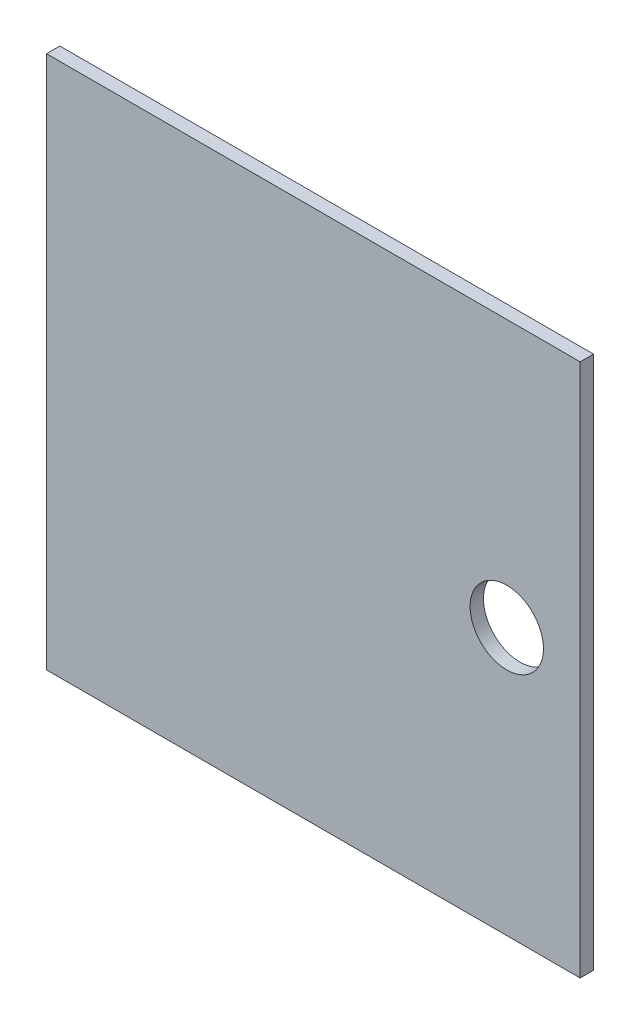
ISO-10303-21;
HEADER;
FILE_DESCRIPTION(('STEP AP214'),'2;1');
FILE_NAME('part.step','',(''),(''),'','','');
FILE_SCHEMA(('AUTOMOTIVE_DESIGN { 1 0 10303 214 1 1 1 1 }'));
ENDSEC;
DATA;
#1=APPLICATION_CONTEXT('core data for automotive mechanical design processes');
#2=APPLICATION_PROTOCOL_DEFINITION('international standard','automotive_design',2000,#1);
#3=PRODUCT_CONTEXT('',#1,'mechanical');
#4=PRODUCT('Part','Part','',(#3));
#5=PRODUCT_RELATED_PRODUCT_CATEGORY('part','',(#4));
#6=PRODUCT_DEFINITION_FORMATION('','',#4);
#7=PRODUCT_DEFINITION_CONTEXT('part definition',#1,'design');
#8=PRODUCT_DEFINITION('design','',#6,#7);
#9=PRODUCT_DEFINITION_SHAPE('','',#8);
#10=(LENGTH_UNIT() NAMED_UNIT(*) SI_UNIT(.MILLI.,.METRE.));
#11=(NAMED_UNIT(*) PLANE_ANGLE_UNIT() SI_UNIT($,.RADIAN.));
#12=(NAMED_UNIT(*) SI_UNIT($,.STERADIAN.) SOLID_ANGLE_UNIT());
#13=UNCERTAINTY_MEASURE_WITH_UNIT(LENGTH_MEASURE(1.E-05),#10,'distance_accuracy_value','');
#14=(GEOMETRIC_REPRESENTATION_CONTEXT(3) GLOBAL_UNCERTAINTY_ASSIGNED_CONTEXT((#13)) GLOBAL_UNIT_ASSIGNED_CONTEXT((#10,
#11,#12)) REPRESENTATION_CONTEXT('',''));
#15=CARTESIAN_POINT('',(0.,0.,0.));
#16=DIRECTION('',(0.,0.,1.));
#17=DIRECTION('',(1.,0.,0.));
#18=AXIS2_PLACEMENT_3D('',#15,#16,#17);
#19=CARTESIAN_POINT('',(0.,0.,10.));
#20=DIRECTION('',(-1.,0.,0.));
#21=DIRECTION('',(0.,0.,1.));
#22=AXIS2_PLACEMENT_3D('',#19,#20,#21);
#23=PLANE('',#22);
#24=DIRECTION('',(0.,1.,0.));
#25=VECTOR('',#24,1.);
#26=CARTESIAN_POINT('',(0.,0.,0.));
#27=LINE('',#26,#25);
#28=CARTESIAN_POINT('',(0.,0.,0.));
#29=VERTEX_POINT('',#28);
#30=CARTESIAN_POINT('',(0.,400.,0.));
#31=VERTEX_POINT('',#30);
#32=EDGE_CURVE('E99',#29,#31,#27,.T.);
#33=ORIENTED_EDGE('',*,*,#32,.F.);
#34=DIRECTION('',(0.,0.,-1.));
#35=VECTOR('',#34,1.);
#36=CARTESIAN_POINT('',(0.,0.,10.));
#37=LINE('',#36,#35);
#38=CARTESIAN_POINT('',(0.,0.,10.));
#39=VERTEX_POINT('',#38);
#40=EDGE_CURVE('E11',#39,#29,#37,.T.);
#41=ORIENTED_EDGE('',*,*,#40,.F.);
#42=DIRECTION('',(0.,1.,0.));
#43=VECTOR('',#42,1.);
#44=CARTESIAN_POINT('',(0.,0.,10.));
#45=LINE('',#44,#43);
#46=CARTESIAN_POINT('',(0.,400.,10.));
#47=VERTEX_POINT('',#46);
#48=EDGE_CURVE('E93',#39,#47,#45,.T.);
#49=ORIENTED_EDGE('',*,*,#48,.T.);
#50=DIRECTION('',(0.,0.,-1.));
#51=VECTOR('',#50,1.);
#52=CARTESIAN_POINT('',(0.,400.,10.));
#53=LINE('',#52,#51);
#54=EDGE_CURVE('E36',#47,#31,#53,.T.);
#55=ORIENTED_EDGE('',*,*,#54,.T.);
#56=EDGE_LOOP('',(#33,#41,#49,#55));
#57=FACE_BOUND('',#56,.T.);
#58=ADVANCED_FACE('F33',(#57),#23,.T.);
#59=CARTESIAN_POINT('',(0.,0.,10.));
#60=DIRECTION('',(0.,1.,0.));
#61=DIRECTION('',(0.,0.,1.));
#62=AXIS2_PLACEMENT_3D('',#59,#60,#61);
#63=PLANE('',#62);
#64=DIRECTION('',(1.,0.,0.));
#65=VECTOR('',#64,1.);
#66=CARTESIAN_POINT('',(0.,0.,0.));
#67=LINE('',#66,#65);
#68=CARTESIAN_POINT('',(400.,0.,0.));
#69=VERTEX_POINT('',#68);
#70=EDGE_CURVE('E66',#29,#69,#67,.T.);
#71=ORIENTED_EDGE('',*,*,#70,.T.);
#72=DIRECTION('',(0.,0.,-1.));
#73=VECTOR('',#72,1.);
#74=CARTESIAN_POINT('',(400.,0.,10.));
#75=LINE('',#74,#73);
#76=CARTESIAN_POINT('',(400.,0.,10.));
#77=VERTEX_POINT('',#76);
#78=EDGE_CURVE('E42',#77,#69,#75,.T.);
#79=ORIENTED_EDGE('',*,*,#78,.F.);
#80=DIRECTION('',(1.,0.,0.));
#81=VECTOR('',#80,1.);
#82=CARTESIAN_POINT('',(0.,0.,10.));
#83=LINE('',#82,#81);
#84=EDGE_CURVE('E83',#39,#77,#83,.T.);
#85=ORIENTED_EDGE('',*,*,#84,.F.);
#86=ORIENTED_EDGE('',*,*,#40,.T.);
#87=EDGE_LOOP('',(#71,#79,#85,#86));
#88=FACE_BOUND('',#87,.T.);
#89=ADVANCED_FACE('F110',(#88),#63,.F.);
#90=CARTESIAN_POINT('',(400.,0.,10.));
#91=DIRECTION('',(-1.,0.,0.));
#92=DIRECTION('',(0.,0.,1.));
#93=AXIS2_PLACEMENT_3D('',#90,#91,#92);
#94=PLANE('',#93);
#95=DIRECTION('',(0.,1.,0.));
#96=VECTOR('',#95,1.);
#97=CARTESIAN_POINT('',(400.,0.,0.));
#98=LINE('',#97,#96);
#99=CARTESIAN_POINT('',(400.,400.,0.));
#100=VERTEX_POINT('',#99);
#101=EDGE_CURVE('E90',#69,#100,#98,.T.);
#102=ORIENTED_EDGE('',*,*,#101,.T.);
#103=DIRECTION('',(0.,0.,-1.));
#104=VECTOR('',#103,1.);
#105=CARTESIAN_POINT('',(400.,400.,10.));
#106=LINE('',#105,#104);
#107=CARTESIAN_POINT('',(400.,400.,10.));
#108=VERTEX_POINT('',#107);
#109=EDGE_CURVE('E87',#108,#100,#106,.T.);
#110=ORIENTED_EDGE('',*,*,#109,.F.);
#111=DIRECTION('',(0.,1.,0.));
#112=VECTOR('',#111,1.);
#113=CARTESIAN_POINT('',(400.,0.,10.));
#114=LINE('',#113,#112);
#115=EDGE_CURVE('E78',#77,#108,#114,.T.);
#116=ORIENTED_EDGE('',*,*,#115,.F.);
#117=ORIENTED_EDGE('',*,*,#78,.T.);
#118=EDGE_LOOP('',(#102,#110,#116,#117));
#119=FACE_BOUND('',#118,.T.);
#120=ADVANCED_FACE('F88',(#119),#94,.F.);
#121=CARTESIAN_POINT('',(0.,400.,10.));
#122=DIRECTION('',(0.,1.,0.));
#123=DIRECTION('',(0.,0.,1.));
#124=AXIS2_PLACEMENT_3D('',#121,#122,#123);
#125=PLANE('',#124);
#126=DIRECTION('',(1.,0.,0.));
#127=VECTOR('',#126,1.);
#128=CARTESIAN_POINT('',(0.,400.,0.));
#129=LINE('',#128,#127);
#130=EDGE_CURVE('E102',#31,#100,#129,.T.);
#131=ORIENTED_EDGE('',*,*,#130,.F.);
#132=ORIENTED_EDGE('',*,*,#54,.F.);
#133=DIRECTION('',(1.,0.,0.));
#134=VECTOR('',#133,1.);
#135=CARTESIAN_POINT('',(0.,400.,10.));
#136=LINE('',#135,#134);
#137=EDGE_CURVE('E82',#47,#108,#136,.T.);
#138=ORIENTED_EDGE('',*,*,#137,.T.);
#139=ORIENTED_EDGE('',*,*,#109,.T.);
#140=EDGE_LOOP('',(#131,#132,#138,#139));
#141=FACE_BOUND('',#140,.T.);
#142=ADVANCED_FACE('F92',(#141),#125,.T.);
#143=CARTESIAN_POINT('',(0.,0.,10.));
#144=DIRECTION('',(0.,0.,-1.));
#145=DIRECTION('',(-1.,0.,0.));
#146=AXIS2_PLACEMENT_3D('',#143,#144,#145);
#147=PLANE('',#146);
#148=CARTESIAN_POINT('',(345.000168937868,199.966321146699,10.));
#149=DIRECTION('',(0.,0.,1.));
#150=DIRECTION('',(1.,0.,0.));
#151=AXIS2_PLACEMENT_3D('',#148,#149,#150);
#152=CIRCLE('',#151,27.5);
#153=CARTESIAN_POINT('',(372.500168937868,199.966321146699,10.));
#154=VERTEX_POINT('',#153);
#155=EDGE_CURVE('E141',#154,#154,#152,.T.);
#156=ORIENTED_EDGE('',*,*,#155,.F.);
#157=EDGE_LOOP('',(#156));
#158=FACE_BOUND('',#157,.T.);
#159=ORIENTED_EDGE('',*,*,#48,.F.);
#160=ORIENTED_EDGE('',*,*,#84,.T.);
#161=ORIENTED_EDGE('',*,*,#115,.T.);
#162=ORIENTED_EDGE('',*,*,#137,.F.);
#163=EDGE_LOOP('',(#159,#160,#161,#162));
#164=FACE_BOUND('',#163,.T.);
#165=ADVANCED_FACE('F81',(#158,#164),#147,.F.);
#166=CARTESIAN_POINT('',(0.,0.,0.));
#167=DIRECTION('',(0.,0.,-1.));
#168=DIRECTION('',(-1.,0.,0.));
#169=AXIS2_PLACEMENT_3D('',#166,#167,#168);
#170=PLANE('',#169);
#171=CARTESIAN_POINT('',(345.000168937868,199.966321146699,0.));
#172=DIRECTION('',(0.,0.,1.));
#173=DIRECTION('',(1.,0.,0.));
#174=AXIS2_PLACEMENT_3D('',#171,#172,#173);
#175=CIRCLE('',#174,27.5);
#176=CARTESIAN_POINT('',(372.500168937868,199.966321146699,0.));
#177=VERTEX_POINT('',#176);
#178=EDGE_CURVE('E103',#177,#177,#175,.T.);
#179=ORIENTED_EDGE('',*,*,#178,.T.);
#180=EDGE_LOOP('',(#179));
#181=FACE_BOUND('',#180,.T.);
#182=ORIENTED_EDGE('',*,*,#32,.T.);
#183=ORIENTED_EDGE('',*,*,#130,.T.);
#184=ORIENTED_EDGE('',*,*,#101,.F.);
#185=ORIENTED_EDGE('',*,*,#70,.F.);
#186=EDGE_LOOP('',(#182,#183,#184,#185));
#187=FACE_BOUND('',#186,.T.);
#188=ADVANCED_FACE('F108',(#181,#187),#170,.T.);
#189=CARTESIAN_POINT('',(345.000168937868,199.966321146699,0.));
#190=DIRECTION('',(0.,0.,1.));
#191=DIRECTION('',(1.,0.,0.));
#192=AXIS2_PLACEMENT_3D('',#189,#190,#191);
#193=CYLINDRICAL_SURFACE('',#192,27.5);
#194=ORIENTED_EDGE('',*,*,#178,.F.);
#195=EDGE_LOOP('',(#194));
#196=FACE_BOUND('',#195,.T.);
#197=ORIENTED_EDGE('',*,*,#155,.T.);
#198=EDGE_LOOP('',(#197));
#199=FACE_BOUND('',#198,.T.);
#200=ADVANCED_FACE('F129',(#196,#199),#193,.F.);
#201=CLOSED_SHELL('',(#58,#89,#120,#142,#165,#188,#200));
#202=MANIFOLD_SOLID_BREP('B2',#201);
#203=ADVANCED_BREP_SHAPE_REPRESENTATION('',(#18,#202),#14);
#204=SHAPE_DEFINITION_REPRESENTATION(#9,#203);
ENDSEC;
END-ISO-10303-21;
